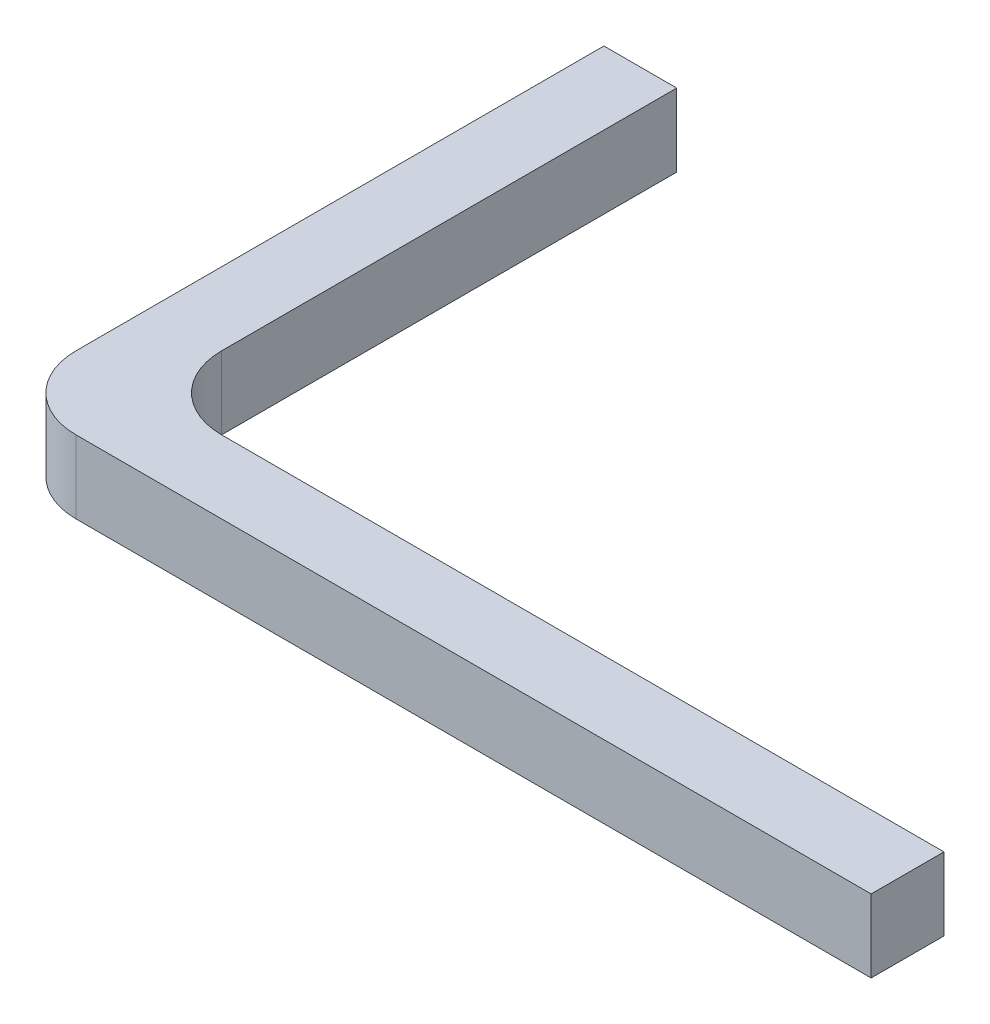
ISO-10303-21;
HEADER;
FILE_DESCRIPTION(('STEP AP214'),'2;1');
FILE_NAME('part.step','',(''),(''),'','','');
FILE_SCHEMA(('AUTOMOTIVE_DESIGN { 1 0 10303 214 1 1 1 1 }'));
ENDSEC;
DATA;
#1=APPLICATION_CONTEXT('core data for automotive mechanical design processes');
#2=APPLICATION_PROTOCOL_DEFINITION('international standard','automotive_design',2000,#1);
#3=PRODUCT_CONTEXT('',#1,'mechanical');
#4=PRODUCT('Part','Part','',(#3));
#5=PRODUCT_RELATED_PRODUCT_CATEGORY('part','',(#4));
#6=PRODUCT_DEFINITION_FORMATION('','',#4);
#7=PRODUCT_DEFINITION_CONTEXT('part definition',#1,'design');
#8=PRODUCT_DEFINITION('design','',#6,#7);
#9=PRODUCT_DEFINITION_SHAPE('','',#8);
#10=(LENGTH_UNIT() NAMED_UNIT(*) SI_UNIT(.MILLI.,.METRE.));
#11=(NAMED_UNIT(*) PLANE_ANGLE_UNIT() SI_UNIT($,.RADIAN.));
#12=(NAMED_UNIT(*) SI_UNIT($,.STERADIAN.) SOLID_ANGLE_UNIT());
#13=UNCERTAINTY_MEASURE_WITH_UNIT(LENGTH_MEASURE(1.E-05),#10,'distance_accuracy_value','');
#14=(GEOMETRIC_REPRESENTATION_CONTEXT(3) GLOBAL_UNCERTAINTY_ASSIGNED_CONTEXT((#13)) GLOBAL_UNIT_ASSIGNED_CONTEXT((#10,
#11,#12)) REPRESENTATION_CONTEXT('',''));
#15=CARTESIAN_POINT('',(0.,0.,0.));
#16=DIRECTION('',(0.,0.,1.));
#17=DIRECTION('',(1.,0.,0.));
#18=AXIS2_PLACEMENT_3D('',#15,#16,#17);
#19=CARTESIAN_POINT('',(0.,20.,-10.));
#20=DIRECTION('',(-1.,0.,0.));
#21=DIRECTION('',(0.,0.,1.));
#22=AXIS2_PLACEMENT_3D('',#19,#20,#21);
#23=PLANE('',#22);
#24=DIRECTION('',(0.,0.,-1.));
#25=VECTOR('',#24,1.);
#26=CARTESIAN_POINT('',(0.,0.,-10.));
#27=LINE('',#26,#25);
#28=CARTESIAN_POINT('',(0.,0.,10.));
#29=VERTEX_POINT('',#28);
#30=CARTESIAN_POINT('',(0.,0.,-10.));
#31=VERTEX_POINT('',#30);
#32=EDGE_CURVE('E130',#29,#31,#27,.T.);
#33=ORIENTED_EDGE('',*,*,#32,.T.);
#34=DIRECTION('',(0.,-1.,0.));
#35=VECTOR('',#34,1.);
#36=CARTESIAN_POINT('',(0.,20.,-10.));
#37=LINE('',#36,#35);
#38=CARTESIAN_POINT('',(0.,20.,-10.));
#39=VERTEX_POINT('',#38);
#40=EDGE_CURVE('E112',#39,#31,#37,.T.);
#41=ORIENTED_EDGE('',*,*,#40,.F.);
#42=DIRECTION('',(0.,0.,-1.));
#43=VECTOR('',#42,1.);
#44=CARTESIAN_POINT('',(0.,20.,-10.));
#45=LINE('',#44,#43);
#46=CARTESIAN_POINT('',(0.,20.,10.));
#47=VERTEX_POINT('',#46);
#48=EDGE_CURVE('E116',#47,#39,#45,.T.);
#49=ORIENTED_EDGE('',*,*,#48,.F.);
#50=DIRECTION('',(0.,-1.,0.));
#51=VECTOR('',#50,1.);
#52=CARTESIAN_POINT('',(0.,20.,10.));
#53=LINE('',#52,#51);
#54=EDGE_CURVE('E185',#47,#29,#53,.T.);
#55=ORIENTED_EDGE('',*,*,#54,.T.);
#56=EDGE_LOOP('',(#33,#41,#49,#55));
#57=FACE_BOUND('',#56,.T.);
#58=ADVANCED_FACE('F45',(#57),#23,.F.);
#59=CARTESIAN_POINT('',(-218.4,20.,-9.99999999999995));
#60=DIRECTION('',(0.,0.,1.));
#61=DIRECTION('',(1.,0.,0.));
#62=AXIS2_PLACEMENT_3D('',#59,#60,#61);
#63=PLANE('',#62);
#64=DIRECTION('',(-1.,0.,0.));
#65=VECTOR('',#64,1.);
#66=CARTESIAN_POINT('',(-218.4,0.,-9.99999999999995));
#67=LINE('',#66,#65);
#68=CARTESIAN_POINT('',(-198.4,0.,-9.99999999999995));
#69=VERTEX_POINT('',#68);
#70=EDGE_CURVE('E163',#31,#69,#67,.T.);
#71=ORIENTED_EDGE('',*,*,#70,.T.);
#72=DIRECTION('',(0.,-1.,0.));
#73=VECTOR('',#72,1.);
#74=CARTESIAN_POINT('',(-198.4,20.,-9.99999999999995));
#75=LINE('',#74,#73);
#76=CARTESIAN_POINT('',(-198.4,20.,-9.99999999999995));
#77=VERTEX_POINT('',#76);
#78=EDGE_CURVE('E67',#69,#77,#75,.F.);
#79=ORIENTED_EDGE('',*,*,#78,.T.);
#80=DIRECTION('',(-1.,0.,0.));
#81=VECTOR('',#80,1.);
#82=CARTESIAN_POINT('',(-218.4,20.,-9.99999999999995));
#83=LINE('',#82,#81);
#84=EDGE_CURVE('E108',#39,#77,#83,.T.);
#85=ORIENTED_EDGE('',*,*,#84,.F.);
#86=ORIENTED_EDGE('',*,*,#40,.T.);
#87=EDGE_LOOP('',(#71,#79,#85,#86));
#88=FACE_BOUND('',#87,.T.);
#89=ADVANCED_FACE('F110',(#88),#63,.F.);
#90=CARTESIAN_POINT('',(-218.4,20.,-155.));
#91=DIRECTION('',(-1.,0.,0.));
#92=DIRECTION('',(0.,0.,1.));
#93=AXIS2_PLACEMENT_3D('',#90,#91,#92);
#94=PLANE('',#93);
#95=DIRECTION('',(0.,0.,-1.));
#96=VECTOR('',#95,1.);
#97=CARTESIAN_POINT('',(-218.4,20.,-155.));
#98=LINE('',#97,#96);
#99=CARTESIAN_POINT('',(-218.4,20.,-29.9999999999999));
#100=VERTEX_POINT('',#99);
#101=CARTESIAN_POINT('',(-218.4,20.,-155.));
#102=VERTEX_POINT('',#101);
#103=EDGE_CURVE('E115',#100,#102,#98,.T.);
#104=ORIENTED_EDGE('',*,*,#103,.F.);
#105=DIRECTION('',(0.,-1.,0.));
#106=VECTOR('',#105,1.);
#107=CARTESIAN_POINT('',(-218.4,0.,-29.9999999999999));
#108=LINE('',#107,#106);
#109=CARTESIAN_POINT('',(-218.4,0.,-29.9999999999999));
#110=VERTEX_POINT('',#109);
#111=EDGE_CURVE('E153',#100,#110,#108,.T.);
#112=ORIENTED_EDGE('',*,*,#111,.T.);
#113=DIRECTION('',(0.,0.,-1.));
#114=VECTOR('',#113,1.);
#115=CARTESIAN_POINT('',(-218.4,0.,-155.));
#116=LINE('',#115,#114);
#117=CARTESIAN_POINT('',(-218.4,0.,-155.));
#118=VERTEX_POINT('',#117);
#119=EDGE_CURVE('E165',#110,#118,#116,.T.);
#120=ORIENTED_EDGE('',*,*,#119,.T.);
#121=DIRECTION('',(0.,-1.,0.));
#122=VECTOR('',#121,1.);
#123=CARTESIAN_POINT('',(-218.4,20.,-155.));
#124=LINE('',#123,#122);
#125=EDGE_CURVE('E133',#102,#118,#124,.T.);
#126=ORIENTED_EDGE('',*,*,#125,.F.);
#127=EDGE_LOOP('',(#104,#112,#120,#126));
#128=FACE_BOUND('',#127,.T.);
#129=ADVANCED_FACE('F171',(#128),#94,.F.);
#130=CARTESIAN_POINT('',(-238.4,20.,-155.));
#131=DIRECTION('',(0.,0.,1.));
#132=DIRECTION('',(1.,0.,0.));
#133=AXIS2_PLACEMENT_3D('',#130,#131,#132);
#134=PLANE('',#133);
#135=DIRECTION('',(-1.,0.,0.));
#136=VECTOR('',#135,1.);
#137=CARTESIAN_POINT('',(-238.4,0.,-155.));
#138=LINE('',#137,#136);
#139=CARTESIAN_POINT('',(-238.4,0.,-155.));
#140=VERTEX_POINT('',#139);
#141=EDGE_CURVE('E190',#118,#140,#138,.T.);
#142=ORIENTED_EDGE('',*,*,#141,.T.);
#143=DIRECTION('',(0.,-1.,0.));
#144=VECTOR('',#143,1.);
#145=CARTESIAN_POINT('',(-238.4,20.,-155.));
#146=LINE('',#145,#144);
#147=CARTESIAN_POINT('',(-238.4,20.,-155.));
#148=VERTEX_POINT('',#147);
#149=EDGE_CURVE('E141',#148,#140,#146,.T.);
#150=ORIENTED_EDGE('',*,*,#149,.F.);
#151=DIRECTION('',(-1.,0.,0.));
#152=VECTOR('',#151,1.);
#153=CARTESIAN_POINT('',(-238.4,20.,-155.));
#154=LINE('',#153,#152);
#155=EDGE_CURVE('E175',#102,#148,#154,.T.);
#156=ORIENTED_EDGE('',*,*,#155,.F.);
#157=ORIENTED_EDGE('',*,*,#125,.T.);
#158=EDGE_LOOP('',(#142,#150,#156,#157));
#159=FACE_BOUND('',#158,.T.);
#160=ADVANCED_FACE('F222',(#159),#134,.F.);
#161=CARTESIAN_POINT('',(-238.4,20.,9.99999999999995));
#162=DIRECTION('',(1.,0.,0.));
#163=DIRECTION('',(0.,0.,-1.));
#164=AXIS2_PLACEMENT_3D('',#161,#162,#163);
#165=PLANE('',#164);
#166=DIRECTION('',(0.,0.,1.));
#167=VECTOR('',#166,1.);
#168=CARTESIAN_POINT('',(-238.4,0.,9.99999999999995));
#169=LINE('',#168,#167);
#170=CARTESIAN_POINT('',(-238.4,0.,-10.));
#171=VERTEX_POINT('',#170);
#172=EDGE_CURVE('E193',#140,#171,#169,.T.);
#173=ORIENTED_EDGE('',*,*,#172,.T.);
#174=DIRECTION('',(0.,-1.,0.));
#175=VECTOR('',#174,1.);
#176=CARTESIAN_POINT('',(-238.4,20.,-10.));
#177=LINE('',#176,#175);
#178=CARTESIAN_POINT('',(-238.4,20.,-10.));
#179=VERTEX_POINT('',#178);
#180=EDGE_CURVE('E147',#171,#179,#177,.F.);
#181=ORIENTED_EDGE('',*,*,#180,.T.);
#182=DIRECTION('',(0.,0.,1.));
#183=VECTOR('',#182,1.);
#184=CARTESIAN_POINT('',(-238.4,20.,9.99999999999995));
#185=LINE('',#184,#183);
#186=EDGE_CURVE('E178',#148,#179,#185,.T.);
#187=ORIENTED_EDGE('',*,*,#186,.F.);
#188=ORIENTED_EDGE('',*,*,#149,.T.);
#189=EDGE_LOOP('',(#173,#181,#187,#188));
#190=FACE_BOUND('',#189,.T.);
#191=ADVANCED_FACE('F206',(#190),#165,.F.);
#192=CARTESIAN_POINT('',(0.,20.,10.));
#193=DIRECTION('',(0.,0.,-1.));
#194=DIRECTION('',(-1.,0.,0.));
#195=AXIS2_PLACEMENT_3D('',#192,#193,#194);
#196=PLANE('',#195);
#197=DIRECTION('',(1.,0.,0.));
#198=VECTOR('',#197,1.);
#199=CARTESIAN_POINT('',(0.,20.,10.));
#200=LINE('',#199,#198);
#201=CARTESIAN_POINT('',(-218.4,20.,9.99999999999996));
#202=VERTEX_POINT('',#201);
#203=EDGE_CURVE('E122',#202,#47,#200,.T.);
#204=ORIENTED_EDGE('',*,*,#203,.F.);
#205=DIRECTION('',(0.,-1.,0.));
#206=VECTOR('',#205,1.);
#207=CARTESIAN_POINT('',(-218.4,20.,9.99999999999996));
#208=LINE('',#207,#206);
#209=CARTESIAN_POINT('',(-218.4,0.,9.99999999999996));
#210=VERTEX_POINT('',#209);
#211=EDGE_CURVE('E132',#202,#210,#208,.T.);
#212=ORIENTED_EDGE('',*,*,#211,.T.);
#213=DIRECTION('',(1.,0.,0.));
#214=VECTOR('',#213,1.);
#215=CARTESIAN_POINT('',(0.,0.,10.));
#216=LINE('',#215,#214);
#217=EDGE_CURVE('E127',#210,#29,#216,.T.);
#218=ORIENTED_EDGE('',*,*,#217,.T.);
#219=ORIENTED_EDGE('',*,*,#54,.F.);
#220=EDGE_LOOP('',(#204,#212,#218,#219));
#221=FACE_BOUND('',#220,.T.);
#222=ADVANCED_FACE('F214',(#221),#196,.F.);
#223=CARTESIAN_POINT('',(0.,20.,0.));
#224=DIRECTION('',(0.,-1.,0.));
#225=DIRECTION('',(0.,0.,-1.));
#226=AXIS2_PLACEMENT_3D('',#223,#224,#225);
#227=PLANE('',#226);
#228=ORIENTED_EDGE('',*,*,#186,.T.);
#229=CARTESIAN_POINT('',(-218.4,20.,-10.));
#230=DIRECTION('',(0.,-1.,0.));
#231=DIRECTION('',(0.,0.,-1.));
#232=AXIS2_PLACEMENT_3D('',#229,#230,#231);
#233=CIRCLE('',#232,20.);
#234=EDGE_CURVE('E150',#179,#202,#233,.F.);
#235=ORIENTED_EDGE('',*,*,#234,.T.);
#236=ORIENTED_EDGE('',*,*,#203,.T.);
#237=ORIENTED_EDGE('',*,*,#48,.T.);
#238=ORIENTED_EDGE('',*,*,#84,.T.);
#239=CARTESIAN_POINT('',(-198.4,20.,-29.9999999999999));
#240=DIRECTION('',(0.,-1.,0.));
#241=DIRECTION('',(0.,0.,-1.));
#242=AXIS2_PLACEMENT_3D('',#239,#240,#241);
#243=CIRCLE('',#242,20.);
#244=EDGE_CURVE('E11',#77,#100,#243,.T.);
#245=ORIENTED_EDGE('',*,*,#244,.T.);
#246=ORIENTED_EDGE('',*,*,#103,.T.);
#247=ORIENTED_EDGE('',*,*,#155,.T.);
#248=EDGE_LOOP('',(#228,#235,#236,#237,#238,#245,#246,#247));
#249=FACE_BOUND('',#248,.T.);
#250=ADVANCED_FACE('F120',(#249),#227,.F.);
#251=CARTESIAN_POINT('',(0.,0.,0.));
#252=DIRECTION('',(0.,-1.,0.));
#253=DIRECTION('',(0.,0.,-1.));
#254=AXIS2_PLACEMENT_3D('',#251,#252,#253);
#255=PLANE('',#254);
#256=ORIENTED_EDGE('',*,*,#217,.F.);
#257=CARTESIAN_POINT('',(-218.4,0.,-10.));
#258=DIRECTION('',(0.,-1.,0.));
#259=DIRECTION('',(0.,0.,-1.));
#260=AXIS2_PLACEMENT_3D('',#257,#258,#259);
#261=CIRCLE('',#260,20.);
#262=EDGE_CURVE('E138',#210,#171,#261,.T.);
#263=ORIENTED_EDGE('',*,*,#262,.T.);
#264=ORIENTED_EDGE('',*,*,#172,.F.);
#265=ORIENTED_EDGE('',*,*,#141,.F.);
#266=ORIENTED_EDGE('',*,*,#119,.F.);
#267=CARTESIAN_POINT('',(-198.4,0.,-29.9999999999999));
#268=DIRECTION('',(0.,-1.,0.));
#269=DIRECTION('',(0.,0.,-1.));
#270=AXIS2_PLACEMENT_3D('',#267,#268,#269);
#271=CIRCLE('',#270,20.);
#272=EDGE_CURVE('E54',#110,#69,#271,.F.);
#273=ORIENTED_EDGE('',*,*,#272,.T.);
#274=ORIENTED_EDGE('',*,*,#70,.F.);
#275=ORIENTED_EDGE('',*,*,#32,.F.);
#276=EDGE_LOOP('',(#256,#263,#264,#265,#266,#273,#274,#275));
#277=FACE_BOUND('',#276,.T.);
#278=ADVANCED_FACE('F162',(#277),#255,.T.);
#279=CARTESIAN_POINT('',(-218.4,20.,-10.));
#280=DIRECTION('',(0.,-1.,0.));
#281=DIRECTION('',(0.,0.,-1.));
#282=AXIS2_PLACEMENT_3D('',#279,#280,#281);
#283=CYLINDRICAL_SURFACE('',#282,20.);
#284=ORIENTED_EDGE('',*,*,#234,.F.);
#285=ORIENTED_EDGE('',*,*,#180,.F.);
#286=ORIENTED_EDGE('',*,*,#262,.F.);
#287=ORIENTED_EDGE('',*,*,#211,.F.);
#288=EDGE_LOOP('',(#284,#285,#286,#287));
#289=FACE_BOUND('',#288,.T.);
#290=ADVANCED_FACE('F212',(#289),#283,.T.);
#291=CARTESIAN_POINT('',(-198.4,20.,-29.9999999999999));
#292=DIRECTION('',(0.,1.,0.));
#293=DIRECTION('',(0.,0.,1.));
#294=AXIS2_PLACEMENT_3D('',#291,#292,#293);
#295=CYLINDRICAL_SURFACE('',#294,20.);
#296=ORIENTED_EDGE('',*,*,#244,.F.);
#297=ORIENTED_EDGE('',*,*,#78,.F.);
#298=ORIENTED_EDGE('',*,*,#272,.F.);
#299=ORIENTED_EDGE('',*,*,#111,.F.);
#300=EDGE_LOOP('',(#296,#297,#298,#299));
#301=FACE_BOUND('',#300,.T.);
#302=ADVANCED_FACE('F47',(#301),#295,.F.);
#303=CLOSED_SHELL('',(#58,#89,#129,#160,#191,#222,#250,#278,#290,#302));
#304=MANIFOLD_SOLID_BREP('B2',#303);
#305=ADVANCED_BREP_SHAPE_REPRESENTATION('',(#18,#304),#14);
#306=SHAPE_DEFINITION_REPRESENTATION(#9,#305);
ENDSEC;
END-ISO-10303-21;
